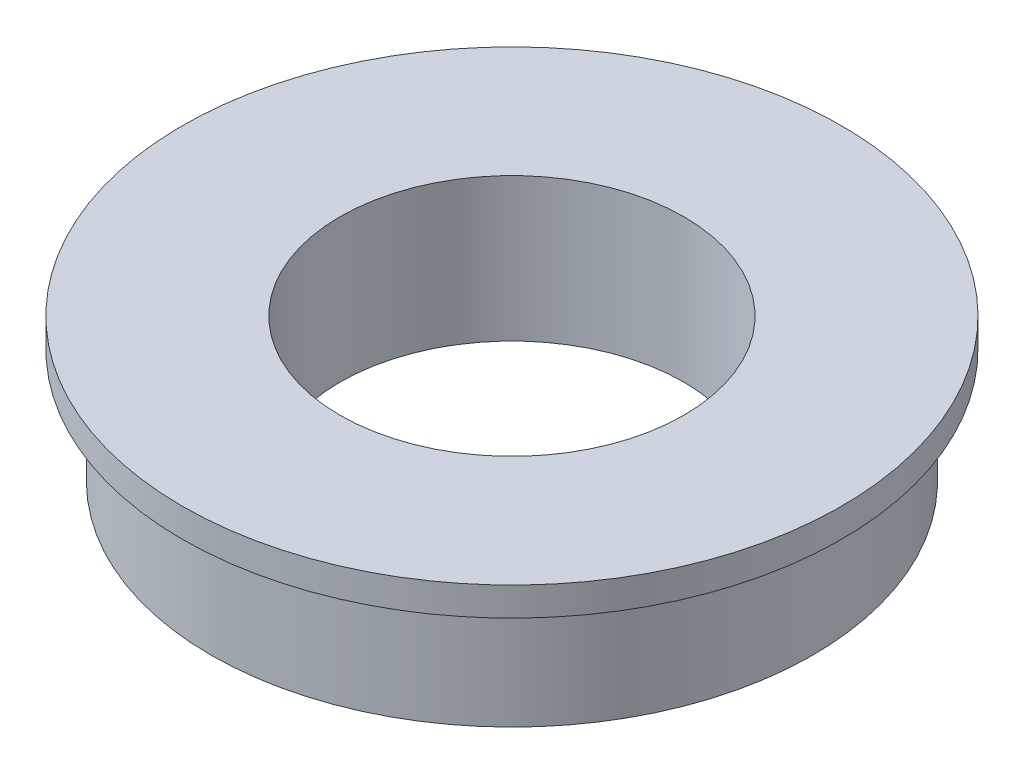
ISO-10303-21;
HEADER;
FILE_DESCRIPTION(('STEP AP214'),'2;1');
FILE_NAME('part.step','',(''),(''),'','','');
FILE_SCHEMA(('AUTOMOTIVE_DESIGN { 1 0 10303 214 1 1 1 1 }'));
ENDSEC;
DATA;
#1=APPLICATION_CONTEXT('core data for automotive mechanical design processes');
#2=APPLICATION_PROTOCOL_DEFINITION('international standard','automotive_design',2000,#1);
#3=PRODUCT_CONTEXT('',#1,'mechanical');
#4=PRODUCT('Part','Part','',(#3));
#5=PRODUCT_RELATED_PRODUCT_CATEGORY('part','',(#4));
#6=PRODUCT_DEFINITION_FORMATION('','',#4);
#7=PRODUCT_DEFINITION_CONTEXT('part definition',#1,'design');
#8=PRODUCT_DEFINITION('design','',#6,#7);
#9=PRODUCT_DEFINITION_SHAPE('','',#8);
#10=(LENGTH_UNIT() NAMED_UNIT(*) SI_UNIT(.MILLI.,.METRE.));
#11=(NAMED_UNIT(*) PLANE_ANGLE_UNIT() SI_UNIT($,.RADIAN.));
#12=(NAMED_UNIT(*) SI_UNIT($,.STERADIAN.) SOLID_ANGLE_UNIT());
#13=UNCERTAINTY_MEASURE_WITH_UNIT(LENGTH_MEASURE(1.E-05),#10,'distance_accuracy_value','');
#14=(GEOMETRIC_REPRESENTATION_CONTEXT(3) GLOBAL_UNCERTAINTY_ASSIGNED_CONTEXT((#13)) GLOBAL_UNIT_ASSIGNED_CONTEXT((#10,
#11,#12)) REPRESENTATION_CONTEXT('',''));
#15=CARTESIAN_POINT('',(0.,0.,0.));
#16=DIRECTION('',(0.,0.,1.));
#17=DIRECTION('',(1.,0.,0.));
#18=AXIS2_PLACEMENT_3D('',#15,#16,#17);
#19=CARTESIAN_POINT('',(0.,-1.06772784651472,-11.5));
#20=DIRECTION('',(0.,-1.,0.));
#21=DIRECTION('',(0.,0.,-1.));
#22=AXIS2_PLACEMENT_3D('',#19,#20,#21);
#23=PLANE('',#22);
#24=CARTESIAN_POINT('',(0.,-1.06772784651472,0.));
#25=DIRECTION('',(0.,1.,0.));
#26=DIRECTION('',(0.,0.,1.));
#27=AXIS2_PLACEMENT_3D('',#24,#25,#26);
#28=CIRCLE('',#27,6.);
#29=CARTESIAN_POINT('',(0.,-1.06772784651472,6.));
#30=VERTEX_POINT('',#29);
#31=EDGE_CURVE('E55',#30,#30,#28,.T.);
#32=ORIENTED_EDGE('',*,*,#31,.F.);
#33=EDGE_LOOP('',(#32));
#34=FACE_BOUND('',#33,.T.);
#35=CARTESIAN_POINT('',(0.,-1.06772784651472,0.));
#36=DIRECTION('',(0.,1.,0.));
#37=DIRECTION('',(0.,0.,1.));
#38=AXIS2_PLACEMENT_3D('',#35,#36,#37);
#39=CIRCLE('',#38,11.5);
#40=CARTESIAN_POINT('',(0.,-1.06772784651472,11.5));
#41=VERTEX_POINT('',#40);
#42=EDGE_CURVE('E10',#41,#41,#39,.T.);
#43=ORIENTED_EDGE('',*,*,#42,.T.);
#44=EDGE_LOOP('',(#43));
#45=FACE_BOUND('',#44,.T.);
#46=ADVANCED_FACE('F33',(#34,#45),#23,.F.);
#47=CARTESIAN_POINT('',(0.,4.00585111251038,0.));
#48=DIRECTION('',(0.,1.,0.));
#49=DIRECTION('',(0.,0.,1.));
#50=AXIS2_PLACEMENT_3D('',#47,#48,#49);
#51=CYLINDRICAL_SURFACE('',#50,11.5);
#52=ORIENTED_EDGE('',*,*,#42,.F.);
#53=EDGE_LOOP('',(#52));
#54=FACE_BOUND('',#53,.T.);
#55=CARTESIAN_POINT('',(0.,-2.06772784651472,0.));
#56=DIRECTION('',(0.,1.,0.));
#57=DIRECTION('',(0.,0.,1.));
#58=AXIS2_PLACEMENT_3D('',#55,#56,#57);
#59=CIRCLE('',#58,11.5);
#60=CARTESIAN_POINT('',(0.,-2.06772784651472,11.5));
#61=VERTEX_POINT('',#60);
#62=EDGE_CURVE('E39',#61,#61,#59,.T.);
#63=ORIENTED_EDGE('',*,*,#62,.T.);
#64=EDGE_LOOP('',(#63));
#65=FACE_BOUND('',#64,.T.);
#66=ADVANCED_FACE('F62',(#54,#65),#51,.T.);
#67=CARTESIAN_POINT('',(0.,-2.06772784651472,-11.5));
#68=DIRECTION('',(0.,1.,0.));
#69=DIRECTION('',(0.,0.,1.));
#70=AXIS2_PLACEMENT_3D('',#67,#68,#69);
#71=PLANE('',#70);
#72=ORIENTED_EDGE('',*,*,#62,.F.);
#73=EDGE_LOOP('',(#72));
#74=FACE_BOUND('',#73,.T.);
#75=CARTESIAN_POINT('',(0.,-2.06772784651472,0.));
#76=DIRECTION('',(0.,1.,0.));
#77=DIRECTION('',(0.,0.,1.));
#78=AXIS2_PLACEMENT_3D('',#75,#76,#77);
#79=CIRCLE('',#78,10.5);
#80=CARTESIAN_POINT('',(0.,-2.06772784651472,10.5));
#81=VERTEX_POINT('',#80);
#82=EDGE_CURVE('E43',#81,#81,#79,.T.);
#83=ORIENTED_EDGE('',*,*,#82,.T.);
#84=EDGE_LOOP('',(#83));
#85=FACE_BOUND('',#84,.T.);
#86=ADVANCED_FACE('F66',(#74,#85),#71,.F.);
#87=CARTESIAN_POINT('',(0.,4.00585111251038,0.));
#88=DIRECTION('',(0.,1.,0.));
#89=DIRECTION('',(0.,0.,1.));
#90=AXIS2_PLACEMENT_3D('',#87,#88,#89);
#91=CYLINDRICAL_SURFACE('',#90,10.5);
#92=ORIENTED_EDGE('',*,*,#82,.F.);
#93=EDGE_LOOP('',(#92));
#94=FACE_BOUND('',#93,.T.);
#95=CARTESIAN_POINT('',(0.,-6.06772784651472,0.));
#96=DIRECTION('',(0.,1.,0.));
#97=DIRECTION('',(0.,0.,1.));
#98=AXIS2_PLACEMENT_3D('',#95,#96,#97);
#99=CIRCLE('',#98,10.5);
#100=CARTESIAN_POINT('',(0.,-6.06772784651472,10.5));
#101=VERTEX_POINT('',#100);
#102=EDGE_CURVE('E47',#101,#101,#99,.T.);
#103=ORIENTED_EDGE('',*,*,#102,.T.);
#104=EDGE_LOOP('',(#103));
#105=FACE_BOUND('',#104,.T.);
#106=ADVANCED_FACE('F71',(#94,#105),#91,.T.);
#107=CARTESIAN_POINT('',(0.,-6.06772784651472,-10.5));
#108=DIRECTION('',(0.,1.,0.));
#109=DIRECTION('',(0.,0.,1.));
#110=AXIS2_PLACEMENT_3D('',#107,#108,#109);
#111=PLANE('',#110);
#112=ORIENTED_EDGE('',*,*,#102,.F.);
#113=EDGE_LOOP('',(#112));
#114=FACE_BOUND('',#113,.T.);
#115=CARTESIAN_POINT('',(0.,-6.06772784651472,0.));
#116=DIRECTION('',(0.,1.,0.));
#117=DIRECTION('',(0.,0.,1.));
#118=AXIS2_PLACEMENT_3D('',#115,#116,#117);
#119=CIRCLE('',#118,6.);
#120=CARTESIAN_POINT('',(0.,-6.06772784651472,6.));
#121=VERTEX_POINT('',#120);
#122=EDGE_CURVE('E52',#121,#121,#119,.T.);
#123=ORIENTED_EDGE('',*,*,#122,.T.);
#124=EDGE_LOOP('',(#123));
#125=FACE_BOUND('',#124,.T.);
#126=ADVANCED_FACE('F77',(#114,#125),#111,.F.);
#127=CARTESIAN_POINT('',(0.,4.00585111251038,0.));
#128=DIRECTION('',(0.,1.,0.));
#129=DIRECTION('',(0.,0.,1.));
#130=AXIS2_PLACEMENT_3D('',#127,#128,#129);
#131=CYLINDRICAL_SURFACE('',#130,6.);
#132=ORIENTED_EDGE('',*,*,#122,.F.);
#133=EDGE_LOOP('',(#132));
#134=FACE_BOUND('',#133,.T.);
#135=ORIENTED_EDGE('',*,*,#31,.T.);
#136=EDGE_LOOP('',(#135));
#137=FACE_BOUND('',#136,.T.);
#138=ADVANCED_FACE('F59',(#134,#137),#131,.F.);
#139=CLOSED_SHELL('',(#46,#66,#86,#106,#126,#138));
#140=MANIFOLD_SOLID_BREP('B2',#139);
#141=ADVANCED_BREP_SHAPE_REPRESENTATION('',(#18,#140),#14);
#142=SHAPE_DEFINITION_REPRESENTATION(#9,#141);
ENDSEC;
END-ISO-10303-21;
